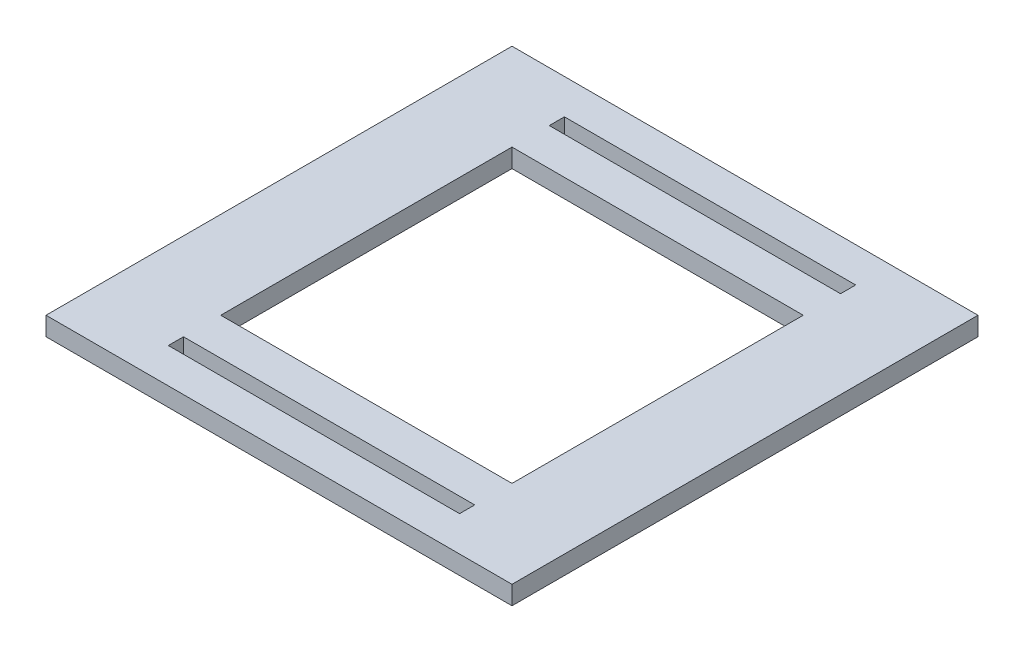
ISO-10303-21;
HEADER;
FILE_DESCRIPTION(('STEP AP214'),'2;1');
FILE_NAME('part.step','',(''),(''),'','','');
FILE_SCHEMA(('AUTOMOTIVE_DESIGN { 1 0 10303 214 1 1 1 1 }'));
ENDSEC;
DATA;
#1=APPLICATION_CONTEXT('core data for automotive mechanical design processes');
#2=APPLICATION_PROTOCOL_DEFINITION('international standard','automotive_design',2000,#1);
#3=PRODUCT_CONTEXT('',#1,'mechanical');
#4=PRODUCT('Part','Part','',(#3));
#5=PRODUCT_RELATED_PRODUCT_CATEGORY('part','',(#4));
#6=PRODUCT_DEFINITION_FORMATION('','',#4);
#7=PRODUCT_DEFINITION_CONTEXT('part definition',#1,'design');
#8=PRODUCT_DEFINITION('design','',#6,#7);
#9=PRODUCT_DEFINITION_SHAPE('','',#8);
#10=(LENGTH_UNIT() NAMED_UNIT(*) SI_UNIT(.MILLI.,.METRE.));
#11=(NAMED_UNIT(*) PLANE_ANGLE_UNIT() SI_UNIT($,.RADIAN.));
#12=(NAMED_UNIT(*) SI_UNIT($,.STERADIAN.) SOLID_ANGLE_UNIT());
#13=UNCERTAINTY_MEASURE_WITH_UNIT(LENGTH_MEASURE(1.E-05),#10,'distance_accuracy_value','');
#14=(GEOMETRIC_REPRESENTATION_CONTEXT(3) GLOBAL_UNCERTAINTY_ASSIGNED_CONTEXT((#13)) GLOBAL_UNIT_ASSIGNED_CONTEXT((#10,
#11,#12)) REPRESENTATION_CONTEXT('',''));
#15=CARTESIAN_POINT('',(0.,0.,0.));
#16=DIRECTION('',(0.,0.,1.));
#17=DIRECTION('',(1.,0.,0.));
#18=AXIS2_PLACEMENT_3D('',#15,#16,#17);
#19=CARTESIAN_POINT('',(-254.,4.064,-50.8));
#20=DIRECTION('',(0.,0.,1.));
#21=DIRECTION('',(1.,0.,0.));
#22=AXIS2_PLACEMENT_3D('',#19,#20,#21);
#23=PLANE('',#22);
#24=DIRECTION('',(-1.,0.,0.));
#25=VECTOR('',#24,1.);
#26=CARTESIAN_POINT('',(-254.,0.,-50.8));
#27=LINE('',#26,#25);
#28=CARTESIAN_POINT('',(50.8000000000001,0.,-50.7999999999999));
#29=VERTEX_POINT('',#28);
#30=CARTESIAN_POINT('',(-50.8,0.,-50.8000000000028));
#31=VERTEX_POINT('',#30);
#32=EDGE_CURVE('E160',#29,#31,#27,.T.);
#33=ORIENTED_EDGE('',*,*,#32,.T.);
#34=DIRECTION('',(0.,-1.,0.));
#35=VECTOR('',#34,1.);
#36=CARTESIAN_POINT('',(-50.8,4.064,-50.7999999999999));
#37=LINE('',#36,#35);
#38=CARTESIAN_POINT('',(-50.8,4.064,-50.7999999999999));
#39=VERTEX_POINT('',#38);
#40=EDGE_CURVE('E50',#39,#31,#37,.T.);
#41=ORIENTED_EDGE('',*,*,#40,.F.);
#42=DIRECTION('',(-1.,0.,0.));
#43=VECTOR('',#42,1.);
#44=CARTESIAN_POINT('',(50.8,4.064,-50.8));
#45=LINE('',#44,#43);
#46=CARTESIAN_POINT('',(50.8000000000001,4.064,-50.7999999999999));
#47=VERTEX_POINT('',#46);
#48=EDGE_CURVE('E11',#47,#39,#45,.T.);
#49=ORIENTED_EDGE('',*,*,#48,.F.);
#50=DIRECTION('',(0.,-1.,0.));
#51=VECTOR('',#50,1.);
#52=CARTESIAN_POINT('',(50.8000000000001,4.064,-50.7999999999999));
#53=LINE('',#52,#51);
#54=EDGE_CURVE('E168',#47,#29,#53,.T.);
#55=ORIENTED_EDGE('',*,*,#54,.T.);
#56=EDGE_LOOP('',(#33,#41,#49,#55));
#57=FACE_BOUND('',#56,.T.);
#58=ADVANCED_FACE('F34',(#57),#23,.F.);
#59=CARTESIAN_POINT('',(-50.8,4.064,50.8));
#60=DIRECTION('',(0.,0.,-1.));
#61=DIRECTION('',(-1.,0.,0.));
#62=AXIS2_PLACEMENT_3D('',#59,#60,#61);
#63=PLANE('',#62);
#64=DIRECTION('',(1.,0.,0.));
#65=VECTOR('',#64,1.);
#66=CARTESIAN_POINT('',(50.8,4.064,50.8));
#67=LINE('',#66,#65);
#68=CARTESIAN_POINT('',(-50.8,4.064,50.7999999999999));
#69=VERTEX_POINT('',#68);
#70=CARTESIAN_POINT('',(50.8000000000001,4.064,50.7999999999999));
#71=VERTEX_POINT('',#70);
#72=EDGE_CURVE('E42',#69,#71,#67,.T.);
#73=ORIENTED_EDGE('',*,*,#72,.F.);
#74=DIRECTION('',(0.,-1.,0.));
#75=VECTOR('',#74,1.);
#76=CARTESIAN_POINT('',(-50.8,4.064,50.7999999999999));
#77=LINE('',#76,#75);
#78=CARTESIAN_POINT('',(-50.8,0.,50.7999999999999));
#79=VERTEX_POINT('',#78);
#80=EDGE_CURVE('E149',#69,#79,#77,.T.);
#81=ORIENTED_EDGE('',*,*,#80,.T.);
#82=DIRECTION('',(1.,0.,0.));
#83=VECTOR('',#82,1.);
#84=CARTESIAN_POINT('',(-50.8,0.,50.8));
#85=LINE('',#84,#83);
#86=CARTESIAN_POINT('',(50.8000000000001,0.,50.8));
#87=VERTEX_POINT('',#86);
#88=EDGE_CURVE('E37',#79,#87,#85,.T.);
#89=ORIENTED_EDGE('',*,*,#88,.T.);
#90=DIRECTION('',(0.,-1.,0.));
#91=VECTOR('',#90,1.);
#92=CARTESIAN_POINT('',(50.8000000000001,4.064,50.7999999999999));
#93=LINE('',#92,#91);
#94=EDGE_CURVE('E58',#71,#87,#93,.T.);
#95=ORIENTED_EDGE('',*,*,#94,.F.);
#96=EDGE_LOOP('',(#73,#81,#89,#95));
#97=FACE_BOUND('',#96,.T.);
#98=ADVANCED_FACE('F273',(#97),#63,.F.);
#99=CARTESIAN_POINT('',(0.,4.064,0.));
#100=DIRECTION('',(0.,1.,0.));
#101=DIRECTION('',(0.,0.,1.));
#102=AXIS2_PLACEMENT_3D('',#99,#100,#101);
#103=PLANE('',#102);
#104=DIRECTION('',(0.,0.,1.));
#105=VECTOR('',#104,1.);
#106=CARTESIAN_POINT('',(-50.8,4.064,50.7999999999999));
#107=LINE('',#106,#105);
#108=EDGE_CURVE('E146',#39,#69,#107,.T.);
#109=ORIENTED_EDGE('',*,*,#108,.T.);
#110=ORIENTED_EDGE('',*,*,#72,.T.);
#111=DIRECTION('',(0.,0.,-1.));
#112=VECTOR('',#111,1.);
#113=CARTESIAN_POINT('',(50.8000000000001,4.064,50.7999999999999));
#114=LINE('',#113,#112);
#115=EDGE_CURVE('E165',#71,#47,#114,.T.);
#116=ORIENTED_EDGE('',*,*,#115,.T.);
#117=ORIENTED_EDGE('',*,*,#48,.T.);
#118=EDGE_LOOP('',(#109,#110,#116,#117));
#119=FACE_BOUND('',#118,.T.);
#120=DIRECTION('',(0.,0.,-1.));
#121=VECTOR('',#120,1.);
#122=CARTESIAN_POINT('',(31.7499999999997,4.064,43.1800000000001));
#123=LINE('',#122,#121);
#124=CARTESIAN_POINT('',(31.7499999999997,4.064,43.1800000000001));
#125=VERTEX_POINT('',#124);
#126=CARTESIAN_POINT('',(31.7499999999997,4.064,39.8780000000001));
#127=VERTEX_POINT('',#126);
#128=EDGE_CURVE('E221',#125,#127,#123,.T.);
#129=ORIENTED_EDGE('',*,*,#128,.F.);
#130=DIRECTION('',(1.,0.,0.));
#131=VECTOR('',#130,1.);
#132=CARTESIAN_POINT('',(-31.7499999999997,4.064,43.1800000000001));
#133=LINE('',#132,#131);
#134=CARTESIAN_POINT('',(-31.7499999999997,4.064,43.1800000000001));
#135=VERTEX_POINT('',#134);
#136=EDGE_CURVE('E211',#135,#125,#133,.T.);
#137=ORIENTED_EDGE('',*,*,#136,.F.);
#138=DIRECTION('',(0.,0.,1.));
#139=VECTOR('',#138,1.);
#140=CARTESIAN_POINT('',(-31.7499999999997,4.064,43.1800000000001));
#141=LINE('',#140,#139);
#142=CARTESIAN_POINT('',(-31.7499999999997,4.064,39.8780000000001));
#143=VERTEX_POINT('',#142);
#144=EDGE_CURVE('E227',#143,#135,#141,.T.);
#145=ORIENTED_EDGE('',*,*,#144,.F.);
#146=DIRECTION('',(-1.,0.,0.));
#147=VECTOR('',#146,1.);
#148=CARTESIAN_POINT('',(-31.7499999999997,4.064,39.8780000000001));
#149=LINE('',#148,#147);
#150=EDGE_CURVE('E223',#127,#143,#149,.T.);
#151=ORIENTED_EDGE('',*,*,#150,.F.);
#152=EDGE_LOOP('',(#129,#137,#145,#151));
#153=FACE_BOUND('',#152,.T.);
#154=DIRECTION('',(0.,0.,1.));
#155=VECTOR('',#154,1.);
#156=CARTESIAN_POINT('',(-31.7499999999997,4.064,-43.1800000000001));
#157=LINE('',#156,#155);
#158=CARTESIAN_POINT('',(-31.7499999999997,4.064,-43.1800000000001));
#159=VERTEX_POINT('',#158);
#160=CARTESIAN_POINT('',(-31.7499999999997,4.064,-39.8780000000001));
#161=VERTEX_POINT('',#160);
#162=EDGE_CURVE('E200',#159,#161,#157,.T.);
#163=ORIENTED_EDGE('',*,*,#162,.F.);
#164=DIRECTION('',(-1.,0.,0.));
#165=VECTOR('',#164,1.);
#166=CARTESIAN_POINT('',(-31.7499999999997,4.064,-43.1800000000001));
#167=LINE('',#166,#165);
#168=CARTESIAN_POINT('',(31.7499999999997,4.064,-43.1800000000001));
#169=VERTEX_POINT('',#168);
#170=EDGE_CURVE('E244',#169,#159,#167,.T.);
#171=ORIENTED_EDGE('',*,*,#170,.F.);
#172=DIRECTION('',(0.,0.,-1.));
#173=VECTOR('',#172,1.);
#174=CARTESIAN_POINT('',(31.7499999999997,4.064,-43.1800000000001));
#175=LINE('',#174,#173);
#176=CARTESIAN_POINT('',(31.7499999999997,4.064,-39.8780000000001));
#177=VERTEX_POINT('',#176);
#178=EDGE_CURVE('E258',#177,#169,#175,.T.);
#179=ORIENTED_EDGE('',*,*,#178,.F.);
#180=DIRECTION('',(1.,0.,0.));
#181=VECTOR('',#180,1.);
#182=CARTESIAN_POINT('',(-31.7499999999997,4.064,-39.8780000000001));
#183=LINE('',#182,#181);
#184=EDGE_CURVE('E255',#161,#177,#183,.T.);
#185=ORIENTED_EDGE('',*,*,#184,.F.);
#186=EDGE_LOOP('',(#163,#171,#179,#185));
#187=FACE_BOUND('',#186,.T.);
#188=DIRECTION('',(0.,0.,-1.));
#189=VECTOR('',#188,1.);
#190=CARTESIAN_POINT('',(31.7499999999997,4.064,-31.75));
#191=LINE('',#190,#189);
#192=CARTESIAN_POINT('',(31.7499999999997,4.064,31.75));
#193=VERTEX_POINT('',#192);
#194=CARTESIAN_POINT('',(31.7499999999997,4.064,-31.75));
#195=VERTEX_POINT('',#194);
#196=EDGE_CURVE('E188',#193,#195,#191,.T.);
#197=ORIENTED_EDGE('',*,*,#196,.F.);
#198=DIRECTION('',(1.,0.,0.));
#199=VECTOR('',#198,1.);
#200=CARTESIAN_POINT('',(-31.7499999999997,4.064,31.75));
#201=LINE('',#200,#199);
#202=CARTESIAN_POINT('',(-31.7499999999997,4.064,31.75));
#203=VERTEX_POINT('',#202);
#204=EDGE_CURVE('E178',#203,#193,#201,.T.);
#205=ORIENTED_EDGE('',*,*,#204,.F.);
#206=DIRECTION('',(0.,0.,1.));
#207=VECTOR('',#206,1.);
#208=CARTESIAN_POINT('',(-31.7499999999997,4.064,-31.75));
#209=LINE('',#208,#207);
#210=CARTESIAN_POINT('',(-31.7499999999997,4.064,-31.75));
#211=VERTEX_POINT('',#210);
#212=EDGE_CURVE('E193',#211,#203,#209,.T.);
#213=ORIENTED_EDGE('',*,*,#212,.F.);
#214=DIRECTION('',(-1.,0.,0.));
#215=VECTOR('',#214,1.);
#216=CARTESIAN_POINT('',(-31.7499999999997,4.064,-31.75));
#217=LINE('',#216,#215);
#218=EDGE_CURVE('E190',#195,#211,#217,.T.);
#219=ORIENTED_EDGE('',*,*,#218,.F.);
#220=EDGE_LOOP('',(#197,#205,#213,#219));
#221=FACE_BOUND('',#220,.T.);
#222=ADVANCED_FACE('F163',(#119,#153,#187,#221),#103,.T.);
#223=CARTESIAN_POINT('',(0.,0.,0.));
#224=DIRECTION('',(0.,1.,0.));
#225=DIRECTION('',(0.,0.,1.));
#226=AXIS2_PLACEMENT_3D('',#223,#224,#225);
#227=PLANE('',#226);
#228=DIRECTION('',(1.,0.,0.));
#229=VECTOR('',#228,1.);
#230=CARTESIAN_POINT('',(-31.7499999999997,0.,43.1800000000001));
#231=LINE('',#230,#229);
#232=CARTESIAN_POINT('',(-31.7499999999997,0.,43.1800000000001));
#233=VERTEX_POINT('',#232);
#234=CARTESIAN_POINT('',(31.7499999999997,0.,43.1800000000001));
#235=VERTEX_POINT('',#234);
#236=EDGE_CURVE('E217',#233,#235,#231,.T.);
#237=ORIENTED_EDGE('',*,*,#236,.T.);
#238=DIRECTION('',(0.,0.,-1.));
#239=VECTOR('',#238,1.);
#240=CARTESIAN_POINT('',(31.7499999999997,0.,43.1800000000001));
#241=LINE('',#240,#239);
#242=CARTESIAN_POINT('',(31.7499999999997,0.,39.8780000000001));
#243=VERTEX_POINT('',#242);
#244=EDGE_CURVE('E207',#235,#243,#241,.T.);
#245=ORIENTED_EDGE('',*,*,#244,.T.);
#246=DIRECTION('',(-1.,0.,0.));
#247=VECTOR('',#246,1.);
#248=CARTESIAN_POINT('',(-31.7499999999997,0.,39.8780000000001));
#249=LINE('',#248,#247);
#250=CARTESIAN_POINT('',(-31.7499999999997,0.,39.8780000000001));
#251=VERTEX_POINT('',#250);
#252=EDGE_CURVE('E210',#243,#251,#249,.T.);
#253=ORIENTED_EDGE('',*,*,#252,.T.);
#254=DIRECTION('',(0.,0.,1.));
#255=VECTOR('',#254,1.);
#256=CARTESIAN_POINT('',(-31.7499999999997,0.,43.1800000000001));
#257=LINE('',#256,#255);
#258=EDGE_CURVE('E214',#251,#233,#257,.T.);
#259=ORIENTED_EDGE('',*,*,#258,.T.);
#260=EDGE_LOOP('',(#237,#245,#253,#259));
#261=FACE_BOUND('',#260,.T.);
#262=DIRECTION('',(-1.,0.,0.));
#263=VECTOR('',#262,1.);
#264=CARTESIAN_POINT('',(-31.7499999999997,0.,-43.1800000000001));
#265=LINE('',#264,#263);
#266=CARTESIAN_POINT('',(31.7499999999997,0.,-43.1800000000001));
#267=VERTEX_POINT('',#266);
#268=CARTESIAN_POINT('',(-31.7499999999997,0.,-43.1800000000001));
#269=VERTEX_POINT('',#268);
#270=EDGE_CURVE('E250',#267,#269,#265,.T.);
#271=ORIENTED_EDGE('',*,*,#270,.T.);
#272=DIRECTION('',(0.,0.,1.));
#273=VECTOR('',#272,1.);
#274=CARTESIAN_POINT('',(-31.7499999999997,0.,-43.1800000000001));
#275=LINE('',#274,#273);
#276=CARTESIAN_POINT('',(-31.7499999999997,0.,-39.8780000000001));
#277=VERTEX_POINT('',#276);
#278=EDGE_CURVE('E240',#269,#277,#275,.T.);
#279=ORIENTED_EDGE('',*,*,#278,.T.);
#280=DIRECTION('',(1.,0.,0.));
#281=VECTOR('',#280,1.);
#282=CARTESIAN_POINT('',(-31.7499999999997,0.,-39.8780000000001));
#283=LINE('',#282,#281);
#284=CARTESIAN_POINT('',(31.7499999999997,0.,-39.8780000000001));
#285=VERTEX_POINT('',#284);
#286=EDGE_CURVE('E243',#277,#285,#283,.T.);
#287=ORIENTED_EDGE('',*,*,#286,.T.);
#288=DIRECTION('',(0.,0.,-1.));
#289=VECTOR('',#288,1.);
#290=CARTESIAN_POINT('',(31.7499999999997,0.,-43.1800000000001));
#291=LINE('',#290,#289);
#292=EDGE_CURVE('E247',#285,#267,#291,.T.);
#293=ORIENTED_EDGE('',*,*,#292,.T.);
#294=EDGE_LOOP('',(#271,#279,#287,#293));
#295=FACE_BOUND('',#294,.T.);
#296=DIRECTION('',(1.,0.,0.));
#297=VECTOR('',#296,1.);
#298=CARTESIAN_POINT('',(-31.7499999999997,0.,31.75));
#299=LINE('',#298,#297);
#300=CARTESIAN_POINT('',(-31.7499999999997,0.,31.75));
#301=VERTEX_POINT('',#300);
#302=CARTESIAN_POINT('',(31.7499999999997,0.,31.75));
#303=VERTEX_POINT('',#302);
#304=EDGE_CURVE('E184',#301,#303,#299,.T.);
#305=ORIENTED_EDGE('',*,*,#304,.T.);
#306=DIRECTION('',(0.,0.,-1.));
#307=VECTOR('',#306,1.);
#308=CARTESIAN_POINT('',(31.7499999999997,0.,-31.75));
#309=LINE('',#308,#307);
#310=CARTESIAN_POINT('',(31.7499999999997,0.,-31.75));
#311=VERTEX_POINT('',#310);
#312=EDGE_CURVE('E174',#303,#311,#309,.T.);
#313=ORIENTED_EDGE('',*,*,#312,.T.);
#314=DIRECTION('',(-1.,0.,0.));
#315=VECTOR('',#314,1.);
#316=CARTESIAN_POINT('',(-31.7499999999997,0.,-31.75));
#317=LINE('',#316,#315);
#318=CARTESIAN_POINT('',(-31.7499999999997,0.,-31.75));
#319=VERTEX_POINT('',#318);
#320=EDGE_CURVE('E177',#311,#319,#317,.T.);
#321=ORIENTED_EDGE('',*,*,#320,.T.);
#322=DIRECTION('',(0.,0.,1.));
#323=VECTOR('',#322,1.);
#324=CARTESIAN_POINT('',(-31.7499999999997,0.,-31.75));
#325=LINE('',#324,#323);
#326=EDGE_CURVE('E181',#319,#301,#325,.T.);
#327=ORIENTED_EDGE('',*,*,#326,.T.);
#328=EDGE_LOOP('',(#305,#313,#321,#327));
#329=FACE_BOUND('',#328,.T.);
#330=ORIENTED_EDGE('',*,*,#88,.F.);
#331=DIRECTION('',(0.,0.,1.));
#332=VECTOR('',#331,1.);
#333=CARTESIAN_POINT('',(-50.8,0.,50.7999999999999));
#334=LINE('',#333,#332);
#335=EDGE_CURVE('E153',#31,#79,#334,.T.);
#336=ORIENTED_EDGE('',*,*,#335,.F.);
#337=ORIENTED_EDGE('',*,*,#32,.F.);
#338=DIRECTION('',(0.,0.,-1.));
#339=VECTOR('',#338,1.);
#340=CARTESIAN_POINT('',(50.8000000000001,0.,50.7999999999999));
#341=LINE('',#340,#339);
#342=EDGE_CURVE('E166',#87,#29,#341,.T.);
#343=ORIENTED_EDGE('',*,*,#342,.F.);
#344=EDGE_LOOP('',(#330,#336,#337,#343));
#345=FACE_BOUND('',#344,.T.);
#346=ADVANCED_FACE('F275',(#261,#295,#329,#345),#227,.F.);
#347=CARTESIAN_POINT('',(31.7499999999997,0.,-31.75));
#348=DIRECTION('',(1.,0.,0.));
#349=DIRECTION('',(0.,0.,-1.));
#350=AXIS2_PLACEMENT_3D('',#347,#348,#349);
#351=PLANE('',#350);
#352=ORIENTED_EDGE('',*,*,#196,.T.);
#353=DIRECTION('',(0.,1.,0.));
#354=VECTOR('',#353,1.);
#355=CARTESIAN_POINT('',(31.7499999999997,0.,-31.75));
#356=LINE('',#355,#354);
#357=EDGE_CURVE('E187',#311,#195,#356,.T.);
#358=ORIENTED_EDGE('',*,*,#357,.F.);
#359=ORIENTED_EDGE('',*,*,#312,.F.);
#360=DIRECTION('',(0.,1.,0.));
#361=VECTOR('',#360,1.);
#362=CARTESIAN_POINT('',(31.7499999999997,0.,31.75));
#363=LINE('',#362,#361);
#364=EDGE_CURVE('E198',#303,#193,#363,.T.);
#365=ORIENTED_EDGE('',*,*,#364,.T.);
#366=EDGE_LOOP('',(#352,#358,#359,#365));
#367=FACE_BOUND('',#366,.T.);
#368=ADVANCED_FACE('F299',(#367),#351,.F.);
#369=CARTESIAN_POINT('',(-31.7499999999997,0.,31.75));
#370=DIRECTION('',(0.,0.,1.));
#371=DIRECTION('',(1.,0.,0.));
#372=AXIS2_PLACEMENT_3D('',#369,#370,#371);
#373=PLANE('',#372);
#374=ORIENTED_EDGE('',*,*,#204,.T.);
#375=ORIENTED_EDGE('',*,*,#364,.F.);
#376=ORIENTED_EDGE('',*,*,#304,.F.);
#377=DIRECTION('',(0.,1.,0.));
#378=VECTOR('',#377,1.);
#379=CARTESIAN_POINT('',(-31.7499999999997,0.,31.75));
#380=LINE('',#379,#378);
#381=EDGE_CURVE('E201',#301,#203,#380,.T.);
#382=ORIENTED_EDGE('',*,*,#381,.T.);
#383=EDGE_LOOP('',(#374,#375,#376,#382));
#384=FACE_BOUND('',#383,.T.);
#385=ADVANCED_FACE('F332',(#384),#373,.F.);
#386=CARTESIAN_POINT('',(-31.7499999999997,0.,-31.75));
#387=DIRECTION('',(-1.,0.,0.));
#388=DIRECTION('',(0.,0.,1.));
#389=AXIS2_PLACEMENT_3D('',#386,#387,#388);
#390=PLANE('',#389);
#391=ORIENTED_EDGE('',*,*,#212,.T.);
#392=ORIENTED_EDGE('',*,*,#381,.F.);
#393=ORIENTED_EDGE('',*,*,#326,.F.);
#394=DIRECTION('',(0.,1.,0.));
#395=VECTOR('',#394,1.);
#396=CARTESIAN_POINT('',(-31.7499999999997,0.,-31.75));
#397=LINE('',#396,#395);
#398=EDGE_CURVE('E203',#319,#211,#397,.T.);
#399=ORIENTED_EDGE('',*,*,#398,.T.);
#400=EDGE_LOOP('',(#391,#392,#393,#399));
#401=FACE_BOUND('',#400,.T.);
#402=ADVANCED_FACE('F336',(#401),#390,.F.);
#403=CARTESIAN_POINT('',(-31.7499999999997,0.,-31.75));
#404=DIRECTION('',(0.,0.,-1.));
#405=DIRECTION('',(-1.,0.,0.));
#406=AXIS2_PLACEMENT_3D('',#403,#404,#405);
#407=PLANE('',#406);
#408=ORIENTED_EDGE('',*,*,#218,.T.);
#409=ORIENTED_EDGE('',*,*,#398,.F.);
#410=ORIENTED_EDGE('',*,*,#320,.F.);
#411=ORIENTED_EDGE('',*,*,#357,.T.);
#412=EDGE_LOOP('',(#408,#409,#410,#411));
#413=FACE_BOUND('',#412,.T.);
#414=ADVANCED_FACE('F306',(#413),#407,.F.);
#415=CARTESIAN_POINT('',(-31.7499999999997,0.,-43.1800000000001));
#416=DIRECTION('',(-1.,0.,0.));
#417=DIRECTION('',(0.,0.,1.));
#418=AXIS2_PLACEMENT_3D('',#415,#416,#417);
#419=PLANE('',#418);
#420=ORIENTED_EDGE('',*,*,#162,.T.);
#421=DIRECTION('',(0.,1.,0.));
#422=VECTOR('',#421,1.);
#423=CARTESIAN_POINT('',(-31.7499999999997,0.,-39.8780000000001));
#424=LINE('',#423,#422);
#425=EDGE_CURVE('E253',#277,#161,#424,.T.);
#426=ORIENTED_EDGE('',*,*,#425,.F.);
#427=ORIENTED_EDGE('',*,*,#278,.F.);
#428=DIRECTION('',(0.,1.,0.));
#429=VECTOR('',#428,1.);
#430=CARTESIAN_POINT('',(-31.7499999999997,0.,-43.1800000000001));
#431=LINE('',#430,#429);
#432=EDGE_CURVE('E224',#269,#159,#431,.T.);
#433=ORIENTED_EDGE('',*,*,#432,.T.);
#434=EDGE_LOOP('',(#420,#426,#427,#433));
#435=FACE_BOUND('',#434,.T.);
#436=ADVANCED_FACE('F302',(#435),#419,.F.);
#437=CARTESIAN_POINT('',(-31.7499999999997,0.,-43.1800000000001));
#438=DIRECTION('',(0.,0.,-1.));
#439=DIRECTION('',(-1.,0.,0.));
#440=AXIS2_PLACEMENT_3D('',#437,#438,#439);
#441=PLANE('',#440);
#442=ORIENTED_EDGE('',*,*,#170,.T.);
#443=ORIENTED_EDGE('',*,*,#432,.F.);
#444=ORIENTED_EDGE('',*,*,#270,.F.);
#445=DIRECTION('',(0.,1.,0.));
#446=VECTOR('',#445,1.);
#447=CARTESIAN_POINT('',(31.7499999999997,0.,-43.1800000000001));
#448=LINE('',#447,#446);
#449=EDGE_CURVE('E264',#267,#169,#448,.T.);
#450=ORIENTED_EDGE('',*,*,#449,.T.);
#451=EDGE_LOOP('',(#442,#443,#444,#450));
#452=FACE_BOUND('',#451,.T.);
#453=ADVANCED_FACE('F305',(#452),#441,.F.);
#454=CARTESIAN_POINT('',(31.7499999999997,0.,-43.1800000000001));
#455=DIRECTION('',(1.,0.,0.));
#456=DIRECTION('',(0.,0.,-1.));
#457=AXIS2_PLACEMENT_3D('',#454,#455,#456);
#458=PLANE('',#457);
#459=ORIENTED_EDGE('',*,*,#178,.T.);
#460=ORIENTED_EDGE('',*,*,#449,.F.);
#461=ORIENTED_EDGE('',*,*,#292,.F.);
#462=DIRECTION('',(0.,1.,0.));
#463=VECTOR('',#462,1.);
#464=CARTESIAN_POINT('',(31.7499999999997,0.,-39.8780000000001));
#465=LINE('',#464,#463);
#466=EDGE_CURVE('E266',#285,#177,#465,.T.);
#467=ORIENTED_EDGE('',*,*,#466,.T.);
#468=EDGE_LOOP('',(#459,#460,#461,#467));
#469=FACE_BOUND('',#468,.T.);
#470=ADVANCED_FACE('F312',(#469),#458,.F.);
#471=CARTESIAN_POINT('',(-31.7499999999997,0.,-39.8780000000001));
#472=DIRECTION('',(0.,0.,1.));
#473=DIRECTION('',(1.,0.,0.));
#474=AXIS2_PLACEMENT_3D('',#471,#472,#473);
#475=PLANE('',#474);
#476=ORIENTED_EDGE('',*,*,#184,.T.);
#477=ORIENTED_EDGE('',*,*,#466,.F.);
#478=ORIENTED_EDGE('',*,*,#286,.F.);
#479=ORIENTED_EDGE('',*,*,#425,.T.);
#480=EDGE_LOOP('',(#476,#477,#478,#479));
#481=FACE_BOUND('',#480,.T.);
#482=ADVANCED_FACE('F308',(#481),#475,.F.);
#483=CARTESIAN_POINT('',(31.7499999999997,0.,43.1800000000001));
#484=DIRECTION('',(1.,0.,0.));
#485=DIRECTION('',(0.,0.,-1.));
#486=AXIS2_PLACEMENT_3D('',#483,#484,#485);
#487=PLANE('',#486);
#488=ORIENTED_EDGE('',*,*,#128,.T.);
#489=DIRECTION('',(0.,1.,0.));
#490=VECTOR('',#489,1.);
#491=CARTESIAN_POINT('',(31.7499999999997,0.,39.8780000000001));
#492=LINE('',#491,#490);
#493=EDGE_CURVE('E220',#243,#127,#492,.T.);
#494=ORIENTED_EDGE('',*,*,#493,.F.);
#495=ORIENTED_EDGE('',*,*,#244,.F.);
#496=DIRECTION('',(0.,1.,0.));
#497=VECTOR('',#496,1.);
#498=CARTESIAN_POINT('',(31.7499999999997,0.,43.1800000000001));
#499=LINE('',#498,#497);
#500=EDGE_CURVE('E232',#235,#125,#499,.T.);
#501=ORIENTED_EDGE('',*,*,#500,.T.);
#502=EDGE_LOOP('',(#488,#494,#495,#501));
#503=FACE_BOUND('',#502,.T.);
#504=ADVANCED_FACE('F311',(#503),#487,.F.);
#505=CARTESIAN_POINT('',(-31.7499999999997,0.,43.1800000000001));
#506=DIRECTION('',(0.,0.,1.));
#507=DIRECTION('',(1.,0.,0.));
#508=AXIS2_PLACEMENT_3D('',#505,#506,#507);
#509=PLANE('',#508);
#510=ORIENTED_EDGE('',*,*,#136,.T.);
#511=ORIENTED_EDGE('',*,*,#500,.F.);
#512=ORIENTED_EDGE('',*,*,#236,.F.);
#513=DIRECTION('',(0.,1.,0.));
#514=VECTOR('',#513,1.);
#515=CARTESIAN_POINT('',(-31.7499999999997,0.,43.1800000000001));
#516=LINE('',#515,#514);
#517=EDGE_CURVE('E234',#233,#135,#516,.T.);
#518=ORIENTED_EDGE('',*,*,#517,.T.);
#519=EDGE_LOOP('',(#510,#511,#512,#518));
#520=FACE_BOUND('',#519,.T.);
#521=ADVANCED_FACE('F321',(#520),#509,.F.);
#522=CARTESIAN_POINT('',(-31.7499999999997,0.,43.1800000000001));
#523=DIRECTION('',(-1.,0.,0.));
#524=DIRECTION('',(0.,0.,1.));
#525=AXIS2_PLACEMENT_3D('',#522,#523,#524);
#526=PLANE('',#525);
#527=ORIENTED_EDGE('',*,*,#144,.T.);
#528=ORIENTED_EDGE('',*,*,#517,.F.);
#529=ORIENTED_EDGE('',*,*,#258,.F.);
#530=DIRECTION('',(0.,1.,0.));
#531=VECTOR('',#530,1.);
#532=CARTESIAN_POINT('',(-31.7499999999997,0.,39.8780000000001));
#533=LINE('',#532,#531);
#534=EDGE_CURVE('E236',#251,#143,#533,.T.);
#535=ORIENTED_EDGE('',*,*,#534,.T.);
#536=EDGE_LOOP('',(#527,#528,#529,#535));
#537=FACE_BOUND('',#536,.T.);
#538=ADVANCED_FACE('F285',(#537),#526,.F.);
#539=CARTESIAN_POINT('',(-31.7499999999997,0.,39.8780000000001));
#540=DIRECTION('',(0.,0.,-1.));
#541=DIRECTION('',(-1.,0.,0.));
#542=AXIS2_PLACEMENT_3D('',#539,#540,#541);
#543=PLANE('',#542);
#544=ORIENTED_EDGE('',*,*,#150,.T.);
#545=ORIENTED_EDGE('',*,*,#534,.F.);
#546=ORIENTED_EDGE('',*,*,#252,.F.);
#547=ORIENTED_EDGE('',*,*,#493,.T.);
#548=EDGE_LOOP('',(#544,#545,#546,#547));
#549=FACE_BOUND('',#548,.T.);
#550=ADVANCED_FACE('F278',(#549),#543,.F.);
#551=CARTESIAN_POINT('',(50.8000000000001,4.064,50.7999999999999));
#552=DIRECTION('',(-1.,0.,0.));
#553=DIRECTION('',(0.,0.,1.));
#554=AXIS2_PLACEMENT_3D('',#551,#552,#553);
#555=PLANE('',#554);
#556=ORIENTED_EDGE('',*,*,#342,.T.);
#557=ORIENTED_EDGE('',*,*,#54,.F.);
#558=ORIENTED_EDGE('',*,*,#115,.F.);
#559=ORIENTED_EDGE('',*,*,#94,.T.);
#560=EDGE_LOOP('',(#556,#557,#558,#559));
#561=FACE_BOUND('',#560,.T.);
#562=ADVANCED_FACE('F276',(#561),#555,.F.);
#563=CARTESIAN_POINT('',(-50.8,4.064,50.7999999999999));
#564=DIRECTION('',(1.,0.,0.));
#565=DIRECTION('',(0.,0.,-1.));
#566=AXIS2_PLACEMENT_3D('',#563,#564,#565);
#567=PLANE('',#566);
#568=ORIENTED_EDGE('',*,*,#335,.T.);
#569=ORIENTED_EDGE('',*,*,#80,.F.);
#570=ORIENTED_EDGE('',*,*,#108,.F.);
#571=ORIENTED_EDGE('',*,*,#40,.T.);
#572=EDGE_LOOP('',(#568,#569,#570,#571));
#573=FACE_BOUND('',#572,.T.);
#574=ADVANCED_FACE('F147',(#573),#567,.F.);
#575=CLOSED_SHELL('',(#58,#98,#222,#346,#368,#385,#402,#414,#436,#453,#470,#482,#504,#521,#538,
#550,#562,#574));
#576=MANIFOLD_SOLID_BREP('B2',#575);
#577=ADVANCED_BREP_SHAPE_REPRESENTATION('',(#18,#576),#14);
#578=SHAPE_DEFINITION_REPRESENTATION(#9,#577);
ENDSEC;
END-ISO-10303-21;
